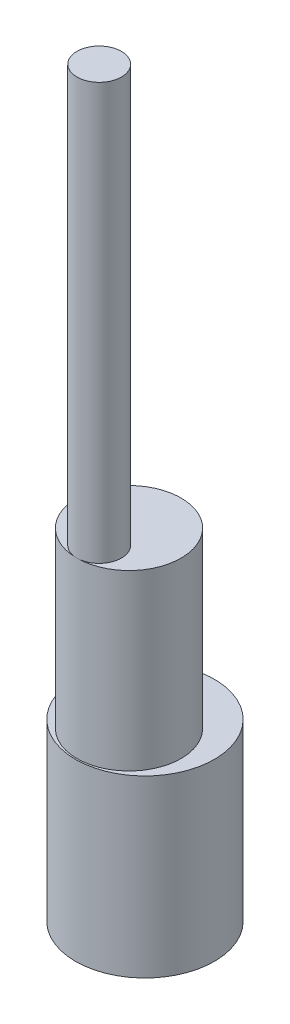
ISO-10303-21;
HEADER;
FILE_DESCRIPTION(('STEP AP214'),'2;1');
FILE_NAME('part.step','',(''),(''),'','','');
FILE_SCHEMA(('AUTOMOTIVE_DESIGN { 1 0 10303 214 1 1 1 1 }'));
ENDSEC;
DATA;
#1=APPLICATION_CONTEXT('core data for automotive mechanical design processes');
#2=APPLICATION_PROTOCOL_DEFINITION('international standard','automotive_design',2000,#1);
#3=PRODUCT_CONTEXT('',#1,'mechanical');
#4=PRODUCT('Part','Part','',(#3));
#5=PRODUCT_RELATED_PRODUCT_CATEGORY('part','',(#4));
#6=PRODUCT_DEFINITION_FORMATION('','',#4);
#7=PRODUCT_DEFINITION_CONTEXT('part definition',#1,'design');
#8=PRODUCT_DEFINITION('design','',#6,#7);
#9=PRODUCT_DEFINITION_SHAPE('','',#8);
#10=(LENGTH_UNIT() NAMED_UNIT(*) SI_UNIT(.MILLI.,.METRE.));
#11=(NAMED_UNIT(*) PLANE_ANGLE_UNIT() SI_UNIT($,.RADIAN.));
#12=(NAMED_UNIT(*) SI_UNIT($,.STERADIAN.) SOLID_ANGLE_UNIT());
#13=UNCERTAINTY_MEASURE_WITH_UNIT(LENGTH_MEASURE(1.E-05),#10,'distance_accuracy_value','');
#14=(GEOMETRIC_REPRESENTATION_CONTEXT(3) GLOBAL_UNCERTAINTY_ASSIGNED_CONTEXT((#13)) GLOBAL_UNIT_ASSIGNED_CONTEXT((#10,
#11,#12)) REPRESENTATION_CONTEXT('',''));
#15=CARTESIAN_POINT('',(0.,0.,0.));
#16=DIRECTION('',(0.,0.,1.));
#17=DIRECTION('',(1.,0.,0.));
#18=AXIS2_PLACEMENT_3D('',#15,#16,#17);
#19=CARTESIAN_POINT('',(0.,-10.,1249.83466753325));
#20=DIRECTION('',(0.,1.,0.));
#21=DIRECTION('',(0.,0.,1.));
#22=AXIS2_PLACEMENT_3D('',#19,#20,#21);
#23=CYLINDRICAL_SURFACE('',#22,500.);
#24=CARTESIAN_POINT('',(0.,-10.,1249.83466753325));
#25=DIRECTION('',(0.,1.,0.));
#26=DIRECTION('',(0.,0.,1.));
#27=AXIS2_PLACEMENT_3D('',#24,#25,#26);
#28=CIRCLE('',#27,500.);
#29=CARTESIAN_POINT('',(0.,-10.,1749.83466753325));
#30=VERTEX_POINT('',#29);
#31=EDGE_CURVE('E44',#30,#30,#28,.T.);
#32=ORIENTED_EDGE('',*,*,#31,.T.);
#33=EDGE_LOOP('',(#32));
#34=FACE_BOUND('',#33,.T.);
#35=CARTESIAN_POINT('',(0.,1250.,1249.83466753325));
#36=DIRECTION('',(0.,1.,0.));
#37=DIRECTION('',(0.,0.,1.));
#38=AXIS2_PLACEMENT_3D('',#35,#36,#37);
#39=CIRCLE('',#38,500.);
#40=CARTESIAN_POINT('',(0.,1250.,1749.83466753325));
#41=VERTEX_POINT('',#40);
#42=EDGE_CURVE('E57',#41,#41,#39,.T.);
#43=ORIENTED_EDGE('',*,*,#42,.F.);
#44=EDGE_LOOP('',(#43));
#45=FACE_BOUND('',#44,.T.);
#46=ADVANCED_FACE('F41',(#34,#45),#23,.T.);
#47=CARTESIAN_POINT('',(0.,-10.,1249.83466753325));
#48=DIRECTION('',(0.,1.,0.));
#49=DIRECTION('',(0.,0.,1.));
#50=AXIS2_PLACEMENT_3D('',#47,#48,#49);
#51=PLANE('',#50);
#52=ORIENTED_EDGE('',*,*,#31,.F.);
#53=EDGE_LOOP('',(#52));
#54=FACE_BOUND('',#53,.T.);
#55=ADVANCED_FACE('F81',(#54),#51,.F.);
#56=CARTESIAN_POINT('',(0.,1250.,1249.83466753325));
#57=DIRECTION('',(0.,1.,0.));
#58=DIRECTION('',(0.,0.,1.));
#59=AXIS2_PLACEMENT_3D('',#56,#57,#58);
#60=PLANE('',#59);
#61=CARTESIAN_POINT('',(0.,1250.,1364.63509965153));
#62=DIRECTION('',(0.,1.,0.));
#63=DIRECTION('',(0.,0.,1.));
#64=AXIS2_PLACEMENT_3D('',#61,#62,#63);
#65=CIRCLE('',#64,375.);
#66=CARTESIAN_POINT('',(0.,1250.,1739.63509965153));
#67=VERTEX_POINT('',#66);
#68=EDGE_CURVE('E11',#67,#67,#65,.T.);
#69=ORIENTED_EDGE('',*,*,#68,.F.);
#70=EDGE_LOOP('',(#69));
#71=FACE_BOUND('',#70,.T.);
#72=ORIENTED_EDGE('',*,*,#42,.T.);
#73=EDGE_LOOP('',(#72));
#74=FACE_BOUND('',#73,.T.);
#75=ADVANCED_FACE('F78',(#71,#74),#60,.T.);
#76=CARTESIAN_POINT('',(0.,2500.,1364.63509965153));
#77=DIRECTION('',(0.,-1.,0.));
#78=DIRECTION('',(0.,0.,-1.));
#79=AXIS2_PLACEMENT_3D('',#76,#77,#78);
#80=CYLINDRICAL_SURFACE('',#79,375.);
#81=CARTESIAN_POINT('',(0.,2500.,1364.63509965153));
#82=DIRECTION('',(0.,1.,0.));
#83=DIRECTION('',(0.,0.,1.));
#84=AXIS2_PLACEMENT_3D('',#81,#82,#83);
#85=CIRCLE('',#84,375.);
#86=CARTESIAN_POINT('',(0.,2500.,1739.63509965153));
#87=VERTEX_POINT('',#86);
#88=EDGE_CURVE('E52',#87,#87,#85,.T.);
#89=ORIENTED_EDGE('',*,*,#88,.F.);
#90=EDGE_LOOP('',(#89));
#91=FACE_BOUND('',#90,.T.);
#92=ORIENTED_EDGE('',*,*,#68,.T.);
#93=EDGE_LOOP('',(#92));
#94=FACE_BOUND('',#93,.T.);
#95=ADVANCED_FACE('F53',(#91,#94),#80,.T.);
#96=CARTESIAN_POINT('',(0.,2500.,1364.63509965153));
#97=DIRECTION('',(0.,1.,0.));
#98=DIRECTION('',(0.,0.,1.));
#99=AXIS2_PLACEMENT_3D('',#96,#97,#98);
#100=PLANE('',#99);
#101=ORIENTED_EDGE('',*,*,#88,.T.);
#102=CARTESIAN_POINT('',(0.,2500.,1579.41559304866));
#103=DIRECTION('',(0.,1.,0.));
#104=DIRECTION('',(0.,0.,1.));
#105=AXIS2_PLACEMENT_3D('',#102,#103,#104);
#106=CIRCLE('',#105,160.219506602873);
#107=EDGE_CURVE('E62',#87,#87,#106,.T.);
#108=ORIENTED_EDGE('',*,*,#107,.F.);
#109=EDGE_LOOP('',(#101,#108));
#110=FACE_BOUND('',#109,.T.);
#111=ADVANCED_FACE('F68',(#110),#100,.T.);
#112=CARTESIAN_POINT('',(0.,5500.,1579.41559304866));
#113=DIRECTION('',(0.,-1.,0.));
#114=DIRECTION('',(0.,0.,-1.));
#115=AXIS2_PLACEMENT_3D('',#112,#113,#114);
#116=CYLINDRICAL_SURFACE('',#115,160.219506602873);
#117=CARTESIAN_POINT('',(0.,5500.,1579.41559304866));
#118=DIRECTION('',(0.,1.,0.));
#119=DIRECTION('',(0.,0.,1.));
#120=AXIS2_PLACEMENT_3D('',#117,#118,#119);
#121=CIRCLE('',#120,160.219506602873);
#122=CARTESIAN_POINT('',(0.,5500.,1739.63509965153));
#123=VERTEX_POINT('',#122);
#124=EDGE_CURVE('E58',#123,#123,#121,.T.);
#125=ORIENTED_EDGE('',*,*,#124,.F.);
#126=EDGE_LOOP('',(#125));
#127=FACE_BOUND('',#126,.T.);
#128=ORIENTED_EDGE('',*,*,#107,.T.);
#129=EDGE_LOOP('',(#128));
#130=FACE_BOUND('',#129,.T.);
#131=ADVANCED_FACE('F67',(#127,#130),#116,.T.);
#132=CARTESIAN_POINT('',(0.,5500.,1579.41559304866));
#133=DIRECTION('',(0.,1.,0.));
#134=DIRECTION('',(0.,0.,1.));
#135=AXIS2_PLACEMENT_3D('',#132,#133,#134);
#136=PLANE('',#135);
#137=ORIENTED_EDGE('',*,*,#124,.T.);
#138=EDGE_LOOP('',(#137));
#139=FACE_BOUND('',#138,.T.);
#140=ADVANCED_FACE('F75',(#139),#136,.T.);
#141=CLOSED_SHELL('',(#46,#55,#75,#95,#111,#131,#140));
#142=MANIFOLD_SOLID_BREP('B2',#141);
#143=ADVANCED_BREP_SHAPE_REPRESENTATION('',(#18,#142),#14);
#144=SHAPE_DEFINITION_REPRESENTATION(#9,#143);
ENDSEC;
END-ISO-10303-21;
